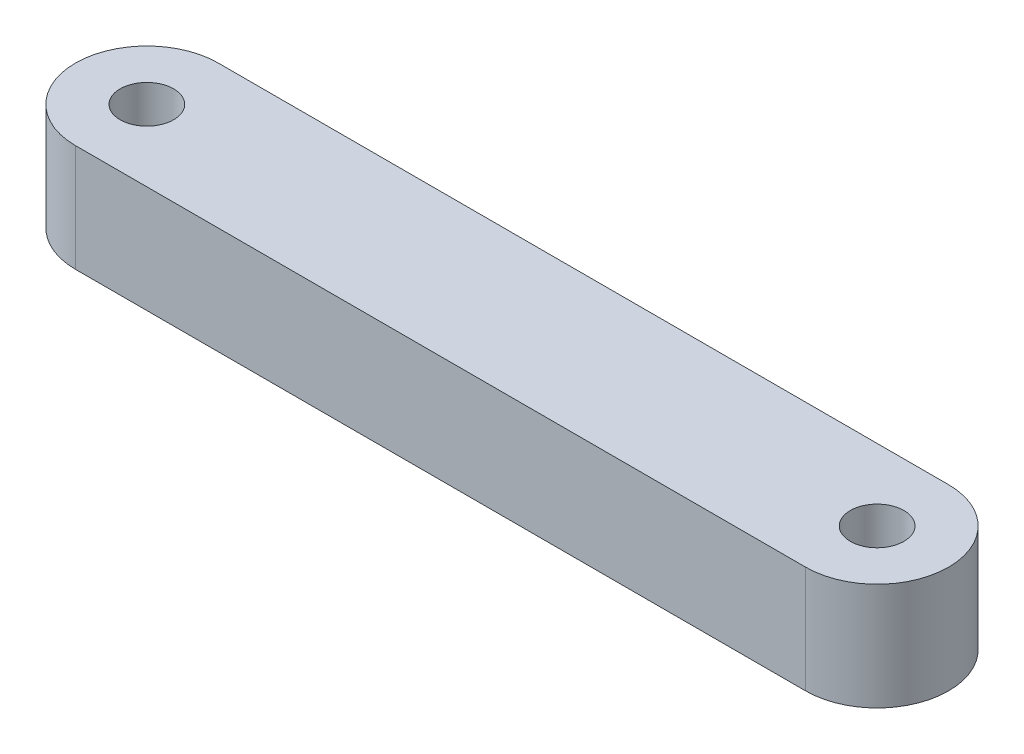
ISO-10303-21;
HEADER;
FILE_DESCRIPTION(('STEP AP214'),'2;1');
FILE_NAME('part.step','',(''),(''),'','','');
FILE_SCHEMA(('AUTOMOTIVE_DESIGN { 1 0 10303 214 1 1 1 1 }'));
ENDSEC;
DATA;
#1=APPLICATION_CONTEXT('core data for automotive mechanical design processes');
#2=APPLICATION_PROTOCOL_DEFINITION('international standard','automotive_design',2000,#1);
#3=PRODUCT_CONTEXT('',#1,'mechanical');
#4=PRODUCT('Part','Part','',(#3));
#5=PRODUCT_RELATED_PRODUCT_CATEGORY('part','',(#4));
#6=PRODUCT_DEFINITION_FORMATION('','',#4);
#7=PRODUCT_DEFINITION_CONTEXT('part definition',#1,'design');
#8=PRODUCT_DEFINITION('design','',#6,#7);
#9=PRODUCT_DEFINITION_SHAPE('','',#8);
#10=(LENGTH_UNIT() NAMED_UNIT(*) SI_UNIT(.MILLI.,.METRE.));
#11=(NAMED_UNIT(*) PLANE_ANGLE_UNIT() SI_UNIT($,.RADIAN.));
#12=(NAMED_UNIT(*) SI_UNIT($,.STERADIAN.) SOLID_ANGLE_UNIT());
#13=UNCERTAINTY_MEASURE_WITH_UNIT(LENGTH_MEASURE(1.E-05),#10,'distance_accuracy_value','');
#14=(GEOMETRIC_REPRESENTATION_CONTEXT(3) GLOBAL_UNCERTAINTY_ASSIGNED_CONTEXT((#13)) GLOBAL_UNIT_ASSIGNED_CONTEXT((#10,
#11,#12)) REPRESENTATION_CONTEXT('',''));
#15=CARTESIAN_POINT('',(0.,0.,0.));
#16=DIRECTION('',(0.,0.,1.));
#17=DIRECTION('',(1.,0.,0.));
#18=AXIS2_PLACEMENT_3D('',#15,#16,#17);
#19=CARTESIAN_POINT('',(-10.22,3.,0.));
#20=DIRECTION('',(0.,1.,0.));
#21=DIRECTION('',(0.,0.,1.));
#22=AXIS2_PLACEMENT_3D('',#19,#20,#21);
#23=PLANE('',#22);
#24=CARTESIAN_POINT('',(-10.22,3.,0.));
#25=DIRECTION('',(0.,1.,0.));
#26=DIRECTION('',(0.,0.,1.));
#27=AXIS2_PLACEMENT_3D('',#24,#25,#26);
#28=CIRCLE('',#27,0.75);
#29=CARTESIAN_POINT('',(-10.22,3.,0.75));
#30=VERTEX_POINT('',#29);
#31=EDGE_CURVE('E115',#30,#30,#28,.T.);
#32=ORIENTED_EDGE('',*,*,#31,.F.);
#33=EDGE_LOOP('',(#32));
#34=FACE_BOUND('',#33,.T.);
#35=CARTESIAN_POINT('',(-10.22,3.,0.));
#36=DIRECTION('',(0.,1.,0.));
#37=DIRECTION('',(0.,0.,1.));
#38=AXIS2_PLACEMENT_3D('',#35,#36,#37);
#39=CIRCLE('',#38,2.);
#40=CARTESIAN_POINT('',(-10.22,3.,-2.));
#41=VERTEX_POINT('',#40);
#42=CARTESIAN_POINT('',(-10.22,3.,2.));
#43=VERTEX_POINT('',#42);
#44=EDGE_CURVE('E95',#41,#43,#39,.T.);
#45=ORIENTED_EDGE('',*,*,#44,.T.);
#46=DIRECTION('',(1.,0.,0.));
#47=VECTOR('',#46,1.);
#48=CARTESIAN_POINT('',(-10.22,3.,2.));
#49=LINE('',#48,#47);
#50=CARTESIAN_POINT('',(10.22,3.,2.));
#51=VERTEX_POINT('',#50);
#52=EDGE_CURVE('E90',#43,#51,#49,.T.);
#53=ORIENTED_EDGE('',*,*,#52,.T.);
#54=CARTESIAN_POINT('',(10.22,3.,0.));
#55=DIRECTION('',(0.,1.,0.));
#56=DIRECTION('',(0.,0.,1.));
#57=AXIS2_PLACEMENT_3D('',#54,#55,#56);
#58=CIRCLE('',#57,2.);
#59=CARTESIAN_POINT('',(10.22,3.,-2.));
#60=VERTEX_POINT('',#59);
#61=EDGE_CURVE('E93',#51,#60,#58,.T.);
#62=ORIENTED_EDGE('',*,*,#61,.T.);
#63=DIRECTION('',(-1.,0.,0.));
#64=VECTOR('',#63,1.);
#65=CARTESIAN_POINT('',(-10.22,3.,-2.));
#66=LINE('',#65,#64);
#67=EDGE_CURVE('E60',#60,#41,#66,.T.);
#68=ORIENTED_EDGE('',*,*,#67,.T.);
#69=EDGE_LOOP('',(#45,#53,#62,#68));
#70=FACE_BOUND('',#69,.T.);
#71=CARTESIAN_POINT('',(10.22,3.,0.));
#72=DIRECTION('',(0.,1.,0.));
#73=DIRECTION('',(0.,0.,-1.));
#74=AXIS2_PLACEMENT_3D('',#71,#72,#73);
#75=CIRCLE('',#74,0.75);
#76=CARTESIAN_POINT('',(10.22,3.,-0.75));
#77=VERTEX_POINT('',#76);
#78=EDGE_CURVE('E137',#77,#77,#75,.T.);
#79=ORIENTED_EDGE('',*,*,#78,.F.);
#80=EDGE_LOOP('',(#79));
#81=FACE_BOUND('',#80,.T.);
#82=ADVANCED_FACE('F42',(#34,#70,#81),#23,.T.);
#83=CARTESIAN_POINT('',(-10.22,0.,0.));
#84=DIRECTION('',(0.,1.,0.));
#85=DIRECTION('',(0.,0.,1.));
#86=AXIS2_PLACEMENT_3D('',#83,#84,#85);
#87=PLANE('',#86);
#88=CARTESIAN_POINT('',(-10.22,0.,0.));
#89=DIRECTION('',(0.,1.,0.));
#90=DIRECTION('',(0.,0.,1.));
#91=AXIS2_PLACEMENT_3D('',#88,#89,#90);
#92=CIRCLE('',#91,2.);
#93=CARTESIAN_POINT('',(-10.22,0.,-2.));
#94=VERTEX_POINT('',#93);
#95=CARTESIAN_POINT('',(-10.22,0.,2.));
#96=VERTEX_POINT('',#95);
#97=EDGE_CURVE('E111',#94,#96,#92,.T.);
#98=ORIENTED_EDGE('',*,*,#97,.F.);
#99=DIRECTION('',(-1.,0.,0.));
#100=VECTOR('',#99,1.);
#101=CARTESIAN_POINT('',(-10.22,0.,-2.));
#102=LINE('',#101,#100);
#103=CARTESIAN_POINT('',(10.22,0.,-2.));
#104=VERTEX_POINT('',#103);
#105=EDGE_CURVE('E83',#104,#94,#102,.T.);
#106=ORIENTED_EDGE('',*,*,#105,.F.);
#107=CARTESIAN_POINT('',(10.22,0.,0.));
#108=DIRECTION('',(0.,1.,0.));
#109=DIRECTION('',(0.,0.,1.));
#110=AXIS2_PLACEMENT_3D('',#107,#108,#109);
#111=CIRCLE('',#110,2.);
#112=CARTESIAN_POINT('',(10.22,0.,2.));
#113=VERTEX_POINT('',#112);
#114=EDGE_CURVE('E77',#113,#104,#111,.T.);
#115=ORIENTED_EDGE('',*,*,#114,.F.);
#116=DIRECTION('',(1.,0.,0.));
#117=VECTOR('',#116,1.);
#118=CARTESIAN_POINT('',(-10.22,0.,2.));
#119=LINE('',#118,#117);
#120=EDGE_CURVE('E100',#96,#113,#119,.T.);
#121=ORIENTED_EDGE('',*,*,#120,.F.);
#122=EDGE_LOOP('',(#98,#106,#115,#121));
#123=FACE_BOUND('',#122,.T.);
#124=CARTESIAN_POINT('',(-10.22,0.,0.));
#125=DIRECTION('',(0.,1.,0.));
#126=DIRECTION('',(0.,0.,1.));
#127=AXIS2_PLACEMENT_3D('',#124,#125,#126);
#128=CIRCLE('',#127,0.75);
#129=CARTESIAN_POINT('',(-10.22,0.,0.75));
#130=VERTEX_POINT('',#129);
#131=EDGE_CURVE('E133',#130,#130,#128,.T.);
#132=ORIENTED_EDGE('',*,*,#131,.T.);
#133=EDGE_LOOP('',(#132));
#134=FACE_BOUND('',#133,.T.);
#135=CARTESIAN_POINT('',(10.22,0.,0.));
#136=DIRECTION('',(0.,1.,0.));
#137=DIRECTION('',(0.,0.,-1.));
#138=AXIS2_PLACEMENT_3D('',#135,#136,#137);
#139=CIRCLE('',#138,0.75);
#140=CARTESIAN_POINT('',(10.22,0.,-0.75));
#141=VERTEX_POINT('',#140);
#142=EDGE_CURVE('E141',#141,#141,#139,.T.);
#143=ORIENTED_EDGE('',*,*,#142,.T.);
#144=EDGE_LOOP('',(#143));
#145=FACE_BOUND('',#144,.T.);
#146=ADVANCED_FACE('F128',(#123,#134,#145),#87,.F.);
#147=CARTESIAN_POINT('',(-10.22,3.,0.));
#148=DIRECTION('',(0.,-1.,0.));
#149=DIRECTION('',(0.,0.,-1.));
#150=AXIS2_PLACEMENT_3D('',#147,#148,#149);
#151=CYLINDRICAL_SURFACE('',#150,2.);
#152=ORIENTED_EDGE('',*,*,#97,.T.);
#153=DIRECTION('',(0.,-1.,0.));
#154=VECTOR('',#153,1.);
#155=CARTESIAN_POINT('',(-10.22,3.,2.));
#156=LINE('',#155,#154);
#157=EDGE_CURVE('E11',#43,#96,#156,.T.);
#158=ORIENTED_EDGE('',*,*,#157,.F.);
#159=ORIENTED_EDGE('',*,*,#44,.F.);
#160=DIRECTION('',(0.,-1.,0.));
#161=VECTOR('',#160,1.);
#162=CARTESIAN_POINT('',(-10.22,3.,-2.));
#163=LINE('',#162,#161);
#164=EDGE_CURVE('E107',#41,#94,#163,.T.);
#165=ORIENTED_EDGE('',*,*,#164,.T.);
#166=EDGE_LOOP('',(#152,#158,#159,#165));
#167=FACE_BOUND('',#166,.T.);
#168=ADVANCED_FACE('F44',(#167),#151,.T.);
#169=CARTESIAN_POINT('',(-10.22,3.,2.));
#170=DIRECTION('',(0.,0.,-1.));
#171=DIRECTION('',(-1.,0.,0.));
#172=AXIS2_PLACEMENT_3D('',#169,#170,#171);
#173=PLANE('',#172);
#174=ORIENTED_EDGE('',*,*,#120,.T.);
#175=DIRECTION('',(0.,-1.,0.));
#176=VECTOR('',#175,1.);
#177=CARTESIAN_POINT('',(10.22,3.,2.));
#178=LINE('',#177,#176);
#179=EDGE_CURVE('E52',#51,#113,#178,.T.);
#180=ORIENTED_EDGE('',*,*,#179,.F.);
#181=ORIENTED_EDGE('',*,*,#52,.F.);
#182=ORIENTED_EDGE('',*,*,#157,.T.);
#183=EDGE_LOOP('',(#174,#180,#181,#182));
#184=FACE_BOUND('',#183,.T.);
#185=ADVANCED_FACE('F99',(#184),#173,.F.);
#186=CARTESIAN_POINT('',(10.22,3.,0.));
#187=DIRECTION('',(0.,-1.,0.));
#188=DIRECTION('',(0.,0.,-1.));
#189=AXIS2_PLACEMENT_3D('',#186,#187,#188);
#190=CYLINDRICAL_SURFACE('',#189,2.);
#191=ORIENTED_EDGE('',*,*,#114,.T.);
#192=DIRECTION('',(0.,-1.,0.));
#193=VECTOR('',#192,1.);
#194=CARTESIAN_POINT('',(10.22,3.,-2.));
#195=LINE('',#194,#193);
#196=EDGE_CURVE('E102',#60,#104,#195,.T.);
#197=ORIENTED_EDGE('',*,*,#196,.F.);
#198=ORIENTED_EDGE('',*,*,#61,.F.);
#199=ORIENTED_EDGE('',*,*,#179,.T.);
#200=EDGE_LOOP('',(#191,#197,#198,#199));
#201=FACE_BOUND('',#200,.T.);
#202=ADVANCED_FACE('F103',(#201),#190,.T.);
#203=CARTESIAN_POINT('',(-10.22,3.,-2.));
#204=DIRECTION('',(0.,0.,1.));
#205=DIRECTION('',(1.,0.,0.));
#206=AXIS2_PLACEMENT_3D('',#203,#204,#205);
#207=PLANE('',#206);
#208=ORIENTED_EDGE('',*,*,#105,.T.);
#209=ORIENTED_EDGE('',*,*,#164,.F.);
#210=ORIENTED_EDGE('',*,*,#67,.F.);
#211=ORIENTED_EDGE('',*,*,#196,.T.);
#212=EDGE_LOOP('',(#208,#209,#210,#211));
#213=FACE_BOUND('',#212,.T.);
#214=ADVANCED_FACE('F125',(#213),#207,.F.);
#215=CARTESIAN_POINT('',(-10.22,3.,0.));
#216=DIRECTION('',(0.,-1.,0.));
#217=DIRECTION('',(0.,0.,-1.));
#218=AXIS2_PLACEMENT_3D('',#215,#216,#217);
#219=CYLINDRICAL_SURFACE('',#218,0.75);
#220=ORIENTED_EDGE('',*,*,#31,.T.);
#221=EDGE_LOOP('',(#220));
#222=FACE_BOUND('',#221,.T.);
#223=ORIENTED_EDGE('',*,*,#131,.F.);
#224=EDGE_LOOP('',(#223));
#225=FACE_BOUND('',#224,.T.);
#226=ADVANCED_FACE('F160',(#222,#225),#219,.F.);
#227=CARTESIAN_POINT('',(10.22,3.,0.));
#228=DIRECTION('',(0.,-1.,0.));
#229=DIRECTION('',(0.,0.,-1.));
#230=AXIS2_PLACEMENT_3D('',#227,#228,#229);
#231=CYLINDRICAL_SURFACE('',#230,0.75);
#232=ORIENTED_EDGE('',*,*,#78,.T.);
#233=EDGE_LOOP('',(#232));
#234=FACE_BOUND('',#233,.T.);
#235=ORIENTED_EDGE('',*,*,#142,.F.);
#236=EDGE_LOOP('',(#235));
#237=FACE_BOUND('',#236,.T.);
#238=ADVANCED_FACE('F149',(#234,#237),#231,.F.);
#239=CLOSED_SHELL('',(#82,#146,#168,#185,#202,#214,#226,#238));
#240=MANIFOLD_SOLID_BREP('B2',#239);
#241=ADVANCED_BREP_SHAPE_REPRESENTATION('',(#18,#240),#14);
#242=SHAPE_DEFINITION_REPRESENTATION(#9,#241);
ENDSEC;
END-ISO-10303-21;
